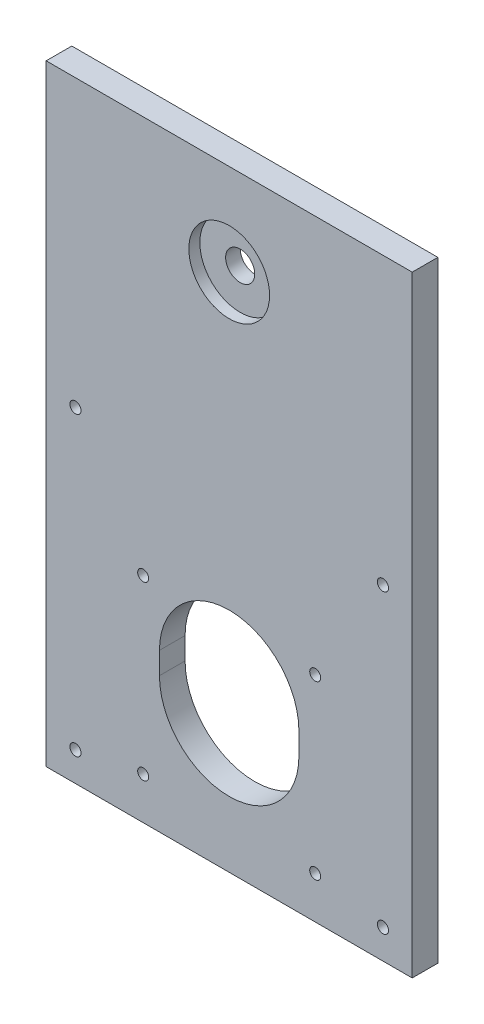
ISO-10303-21;
HEADER;
FILE_DESCRIPTION(('STEP AP214'),'2;1');
FILE_NAME('part.step','',(''),(''),'','','');
FILE_SCHEMA(('AUTOMOTIVE_DESIGN { 1 0 10303 214 1 1 1 1 }'));
ENDSEC;
DATA;
#1=APPLICATION_CONTEXT('core data for automotive mechanical design processes');
#2=APPLICATION_PROTOCOL_DEFINITION('international standard','automotive_design',2000,#1);
#3=PRODUCT_CONTEXT('',#1,'mechanical');
#4=PRODUCT('Part','Part','',(#3));
#5=PRODUCT_RELATED_PRODUCT_CATEGORY('part','',(#4));
#6=PRODUCT_DEFINITION_FORMATION('','',#4);
#7=PRODUCT_DEFINITION_CONTEXT('part definition',#1,'design');
#8=PRODUCT_DEFINITION('design','',#6,#7);
#9=PRODUCT_DEFINITION_SHAPE('','',#8);
#10=(LENGTH_UNIT() NAMED_UNIT(*) SI_UNIT(.MILLI.,.METRE.));
#11=(NAMED_UNIT(*) PLANE_ANGLE_UNIT() SI_UNIT($,.RADIAN.));
#12=(NAMED_UNIT(*) SI_UNIT($,.STERADIAN.) SOLID_ANGLE_UNIT());
#13=UNCERTAINTY_MEASURE_WITH_UNIT(LENGTH_MEASURE(1.E-05),#10,'distance_accuracy_value','');
#14=(GEOMETRIC_REPRESENTATION_CONTEXT(3) GLOBAL_UNCERTAINTY_ASSIGNED_CONTEXT((#13)) GLOBAL_UNIT_ASSIGNED_CONTEXT((#10,
#11,#12)) REPRESENTATION_CONTEXT('',''));
#15=CARTESIAN_POINT('',(0.,0.,0.));
#16=DIRECTION('',(0.,0.,1.));
#17=DIRECTION('',(1.,0.,0.));
#18=AXIS2_PLACEMENT_3D('',#15,#16,#17);
#19=CARTESIAN_POINT('',(0.,18.5,7.));
#20=DIRECTION('',(0.,0.,-1.));
#21=DIRECTION('',(-1.,0.,0.));
#22=AXIS2_PLACEMENT_3D('',#19,#20,#21);
#23=CYLINDRICAL_SURFACE('',#22,3.975);
#24=CARTESIAN_POINT('',(0.,18.5,0.));
#25=DIRECTION('',(0.,0.,1.));
#26=DIRECTION('',(1.,0.,0.));
#27=AXIS2_PLACEMENT_3D('',#24,#25,#26);
#28=CIRCLE('',#27,3.975);
#29=CARTESIAN_POINT('',(3.97499999999999,18.5,0.));
#30=VERTEX_POINT('',#29);
#31=EDGE_CURVE('E218',#30,#30,#28,.T.);
#32=ORIENTED_EDGE('',*,*,#31,.F.);
#33=EDGE_LOOP('',(#32));
#34=FACE_BOUND('',#33,.T.);
#35=CARTESIAN_POINT('',(0.,18.5,4.));
#36=DIRECTION('',(0.,0.,1.));
#37=DIRECTION('',(1.,0.,0.));
#38=AXIS2_PLACEMENT_3D('',#35,#36,#37);
#39=CIRCLE('',#38,3.975);
#40=CARTESIAN_POINT('',(3.97499999999999,18.5,4.));
#41=VERTEX_POINT('',#40);
#42=EDGE_CURVE('E47',#41,#41,#39,.T.);
#43=ORIENTED_EDGE('',*,*,#42,.T.);
#44=EDGE_LOOP('',(#43));
#45=FACE_BOUND('',#44,.T.);
#46=ADVANCED_FACE('F43',(#34,#45),#23,.F.);
#47=CARTESIAN_POINT('',(0.,0.,7.));
#48=DIRECTION('',(0.,0.,1.));
#49=DIRECTION('',(1.,0.,0.));
#50=AXIS2_PLACEMENT_3D('',#47,#48,#49);
#51=PLANE('',#50);
#52=DIRECTION('',(1.,0.,0.));
#53=VECTOR('',#52,1.);
#54=CARTESIAN_POINT('',(-50.,43.5,7.));
#55=LINE('',#54,#53);
#56=CARTESIAN_POINT('',(-50.,43.5,7.));
#57=VERTEX_POINT('',#56);
#58=CARTESIAN_POINT('',(50.,43.5,7.));
#59=VERTEX_POINT('',#58);
#60=EDGE_CURVE('E111',#57,#59,#55,.T.);
#61=ORIENTED_EDGE('',*,*,#60,.F.);
#62=DIRECTION('',(0.,-1.,0.));
#63=VECTOR('',#62,1.);
#64=CARTESIAN_POINT('',(-50.,123.5,7.));
#65=LINE('',#64,#63);
#66=CARTESIAN_POINT('',(-50.,-123.5,7.));
#67=VERTEX_POINT('',#66);
#68=EDGE_CURVE('E151',#57,#67,#65,.T.);
#69=ORIENTED_EDGE('',*,*,#68,.T.);
#70=DIRECTION('',(1.,0.,0.));
#71=VECTOR('',#70,1.);
#72=CARTESIAN_POINT('',(-50.,-123.5,7.));
#73=LINE('',#72,#71);
#74=CARTESIAN_POINT('',(50.,-123.5,7.));
#75=VERTEX_POINT('',#74);
#76=EDGE_CURVE('E143',#67,#75,#73,.T.);
#77=ORIENTED_EDGE('',*,*,#76,.T.);
#78=DIRECTION('',(0.,1.,0.));
#79=VECTOR('',#78,1.);
#80=CARTESIAN_POINT('',(50.,123.5,7.));
#81=LINE('',#80,#79);
#82=EDGE_CURVE('E148',#75,#59,#81,.T.);
#83=ORIENTED_EDGE('',*,*,#82,.T.);
#84=EDGE_LOOP('',(#61,#69,#77,#83));
#85=FACE_BOUND('',#84,.T.);
#86=CARTESIAN_POINT('',(0.,18.5,7.));
#87=DIRECTION('',(0.,0.,1.));
#88=DIRECTION('',(1.,0.,0.));
#89=AXIS2_PLACEMENT_3D('',#86,#87,#88);
#90=CIRCLE('',#89,11.025);
#91=CARTESIAN_POINT('',(11.025,18.5,7.));
#92=VERTEX_POINT('',#91);
#93=EDGE_CURVE('E117',#92,#92,#90,.T.);
#94=ORIENTED_EDGE('',*,*,#93,.F.);
#95=EDGE_LOOP('',(#94));
#96=FACE_BOUND('',#95,.T.);
#97=CARTESIAN_POINT('',(23.5,-112.,7.));
#98=DIRECTION('',(0.,0.,1.));
#99=DIRECTION('',(1.,0.,0.));
#100=AXIS2_PLACEMENT_3D('',#97,#98,#99);
#101=CIRCLE('',#100,1.5);
#102=CARTESIAN_POINT('',(25.,-112.,7.));
#103=VERTEX_POINT('',#102);
#104=EDGE_CURVE('E245',#103,#103,#101,.T.);
#105=ORIENTED_EDGE('',*,*,#104,.F.);
#106=EDGE_LOOP('',(#105));
#107=FACE_BOUND('',#106,.T.);
#108=CARTESIAN_POINT('',(-23.5,-112.,7.));
#109=DIRECTION('',(0.,0.,1.));
#110=DIRECTION('',(1.,0.,0.));
#111=AXIS2_PLACEMENT_3D('',#108,#109,#110);
#112=CIRCLE('',#111,1.5);
#113=CARTESIAN_POINT('',(-22.,-112.,7.));
#114=VERTEX_POINT('',#113);
#115=EDGE_CURVE('E232',#114,#114,#112,.T.);
#116=ORIENTED_EDGE('',*,*,#115,.F.);
#117=EDGE_LOOP('',(#116));
#118=FACE_BOUND('',#117,.T.);
#119=DIRECTION('',(0.,-1.,0.));
#120=VECTOR('',#119,1.);
#121=CARTESIAN_POINT('',(-19.05,-80.5,7.));
#122=LINE('',#121,#120);
#123=CARTESIAN_POINT('',(-19.05,-80.5,7.));
#124=VERTEX_POINT('',#123);
#125=CARTESIAN_POINT('',(-19.05,-86.5,7.));
#126=VERTEX_POINT('',#125);
#127=EDGE_CURVE('E224',#124,#126,#122,.T.);
#128=ORIENTED_EDGE('',*,*,#127,.F.);
#129=CARTESIAN_POINT('',(0.,-80.5,7.));
#130=DIRECTION('',(0.,0.,1.));
#131=DIRECTION('',(1.,0.,0.));
#132=AXIS2_PLACEMENT_3D('',#129,#130,#131);
#133=CIRCLE('',#132,19.05);
#134=CARTESIAN_POINT('',(19.05,-80.5,7.));
#135=VERTEX_POINT('',#134);
#136=EDGE_CURVE('E205',#135,#124,#133,.T.);
#137=ORIENTED_EDGE('',*,*,#136,.F.);
#138=DIRECTION('',(0.,1.,0.));
#139=VECTOR('',#138,1.);
#140=CARTESIAN_POINT('',(19.05,-86.5,7.));
#141=LINE('',#140,#139);
#142=CARTESIAN_POINT('',(19.05,-86.5,7.));
#143=VERTEX_POINT('',#142);
#144=EDGE_CURVE('E200',#143,#135,#141,.T.);
#145=ORIENTED_EDGE('',*,*,#144,.F.);
#146=CARTESIAN_POINT('',(0.,-86.5,7.));
#147=DIRECTION('',(0.,0.,1.));
#148=DIRECTION('',(1.,0.,0.));
#149=AXIS2_PLACEMENT_3D('',#146,#147,#148);
#150=CIRCLE('',#149,19.05);
#151=EDGE_CURVE('E221',#126,#143,#150,.T.);
#152=ORIENTED_EDGE('',*,*,#151,.F.);
#153=EDGE_LOOP('',(#128,#137,#145,#152));
#154=FACE_BOUND('',#153,.T.);
#155=CARTESIAN_POINT('',(42.,-115.5,7.));
#156=DIRECTION('',(0.,0.,1.));
#157=DIRECTION('',(1.,0.,0.));
#158=AXIS2_PLACEMENT_3D('',#155,#156,#157);
#159=CIRCLE('',#158,1.525);
#160=CARTESIAN_POINT('',(43.525,-115.5,7.));
#161=VERTEX_POINT('',#160);
#162=EDGE_CURVE('E176',#161,#161,#159,.T.);
#163=ORIENTED_EDGE('',*,*,#162,.F.);
#164=EDGE_LOOP('',(#163));
#165=FACE_BOUND('',#164,.T.);
#166=CARTESIAN_POINT('',(42.,-34.5,7.));
#167=DIRECTION('',(0.,0.,1.));
#168=DIRECTION('',(1.,0.,0.));
#169=AXIS2_PLACEMENT_3D('',#166,#167,#168);
#170=CIRCLE('',#169,1.525);
#171=CARTESIAN_POINT('',(43.525,-34.5,7.));
#172=VERTEX_POINT('',#171);
#173=EDGE_CURVE('E162',#172,#172,#170,.T.);
#174=ORIENTED_EDGE('',*,*,#173,.F.);
#175=EDGE_LOOP('',(#174));
#176=FACE_BOUND('',#175,.T.);
#177=CARTESIAN_POINT('',(-42.,-34.5,7.));
#178=DIRECTION('',(0.,0.,1.));
#179=DIRECTION('',(1.,0.,0.));
#180=AXIS2_PLACEMENT_3D('',#177,#178,#179);
#181=CIRCLE('',#180,1.525);
#182=CARTESIAN_POINT('',(-40.475,-34.5,7.));
#183=VERTEX_POINT('',#182);
#184=EDGE_CURVE('E133',#183,#183,#181,.T.);
#185=ORIENTED_EDGE('',*,*,#184,.F.);
#186=EDGE_LOOP('',(#185));
#187=FACE_BOUND('',#186,.T.);
#188=CARTESIAN_POINT('',(-42.,-115.5,7.));
#189=DIRECTION('',(0.,0.,1.));
#190=DIRECTION('',(1.,0.,0.));
#191=AXIS2_PLACEMENT_3D('',#188,#189,#190);
#192=CIRCLE('',#191,1.525);
#193=CARTESIAN_POINT('',(-40.475,-115.5,7.));
#194=VERTEX_POINT('',#193);
#195=EDGE_CURVE('E168',#194,#194,#192,.T.);
#196=ORIENTED_EDGE('',*,*,#195,.F.);
#197=EDGE_LOOP('',(#196));
#198=FACE_BOUND('',#197,.T.);
#199=CARTESIAN_POINT('',(-23.5,-65.,7.));
#200=DIRECTION('',(0.,0.,1.));
#201=DIRECTION('',(1.,0.,0.));
#202=AXIS2_PLACEMENT_3D('',#199,#200,#201);
#203=CIRCLE('',#202,1.5);
#204=CARTESIAN_POINT('',(-22.,-65.,7.));
#205=VERTEX_POINT('',#204);
#206=EDGE_CURVE('E237',#205,#205,#203,.T.);
#207=ORIENTED_EDGE('',*,*,#206,.F.);
#208=EDGE_LOOP('',(#207));
#209=FACE_BOUND('',#208,.T.);
#210=CARTESIAN_POINT('',(23.5,-65.,7.));
#211=DIRECTION('',(0.,0.,1.));
#212=DIRECTION('',(1.,0.,0.));
#213=AXIS2_PLACEMENT_3D('',#210,#211,#212);
#214=CIRCLE('',#213,1.5);
#215=CARTESIAN_POINT('',(25.,-65.,7.));
#216=VERTEX_POINT('',#215);
#217=EDGE_CURVE('E253',#216,#216,#214,.T.);
#218=ORIENTED_EDGE('',*,*,#217,.F.);
#219=EDGE_LOOP('',(#218));
#220=FACE_BOUND('',#219,.T.);
#221=ADVANCED_FACE('F292',(#85,#96,#107,#118,#154,#165,#176,#187,#198,#209,#220),#51,.T.);
#222=CARTESIAN_POINT('',(0.,0.,0.));
#223=DIRECTION('',(0.,0.,1.));
#224=DIRECTION('',(1.,0.,0.));
#225=AXIS2_PLACEMENT_3D('',#222,#223,#224);
#226=PLANE('',#225);
#227=CARTESIAN_POINT('',(42.,-115.5,0.));
#228=DIRECTION('',(0.,0.,1.));
#229=DIRECTION('',(1.,0.,0.));
#230=AXIS2_PLACEMENT_3D('',#227,#228,#229);
#231=CIRCLE('',#230,1.525);
#232=CARTESIAN_POINT('',(43.525,-115.5,0.));
#233=VERTEX_POINT('',#232);
#234=EDGE_CURVE('E180',#233,#233,#231,.T.);
#235=ORIENTED_EDGE('',*,*,#234,.T.);
#236=EDGE_LOOP('',(#235));
#237=FACE_BOUND('',#236,.T.);
#238=CARTESIAN_POINT('',(-42.,-115.5,0.));
#239=DIRECTION('',(0.,0.,1.));
#240=DIRECTION('',(1.,0.,0.));
#241=AXIS2_PLACEMENT_3D('',#238,#239,#240);
#242=CIRCLE('',#241,1.525);
#243=CARTESIAN_POINT('',(-40.475,-115.5,0.));
#244=VERTEX_POINT('',#243);
#245=EDGE_CURVE('E172',#244,#244,#242,.T.);
#246=ORIENTED_EDGE('',*,*,#245,.T.);
#247=EDGE_LOOP('',(#246));
#248=FACE_BOUND('',#247,.T.);
#249=CARTESIAN_POINT('',(42.,-34.5,0.));
#250=DIRECTION('',(0.,0.,1.));
#251=DIRECTION('',(1.,0.,0.));
#252=AXIS2_PLACEMENT_3D('',#249,#250,#251);
#253=CIRCLE('',#252,1.525);
#254=CARTESIAN_POINT('',(43.525,-34.5,0.));
#255=VERTEX_POINT('',#254);
#256=EDGE_CURVE('E164',#255,#255,#253,.T.);
#257=ORIENTED_EDGE('',*,*,#256,.T.);
#258=EDGE_LOOP('',(#257));
#259=FACE_BOUND('',#258,.T.);
#260=CARTESIAN_POINT('',(-42.,-34.5,0.));
#261=DIRECTION('',(0.,0.,1.));
#262=DIRECTION('',(1.,0.,0.));
#263=AXIS2_PLACEMENT_3D('',#260,#261,#262);
#264=CIRCLE('',#263,1.525);
#265=CARTESIAN_POINT('',(-40.475,-34.5,0.));
#266=VERTEX_POINT('',#265);
#267=EDGE_CURVE('E140',#266,#266,#264,.T.);
#268=ORIENTED_EDGE('',*,*,#267,.T.);
#269=EDGE_LOOP('',(#268));
#270=FACE_BOUND('',#269,.T.);
#271=DIRECTION('',(0.,-1.,0.));
#272=VECTOR('',#271,1.);
#273=CARTESIAN_POINT('',(-50.,123.5,0.));
#274=LINE('',#273,#272);
#275=CARTESIAN_POINT('',(-50.,43.5,0.));
#276=VERTEX_POINT('',#275);
#277=CARTESIAN_POINT('',(-50.,-123.5,0.));
#278=VERTEX_POINT('',#277);
#279=EDGE_CURVE('E127',#276,#278,#274,.T.);
#280=ORIENTED_EDGE('',*,*,#279,.F.);
#281=DIRECTION('',(1.,0.,0.));
#282=VECTOR('',#281,1.);
#283=CARTESIAN_POINT('',(-50.,43.5,0.));
#284=LINE('',#283,#282);
#285=CARTESIAN_POINT('',(50.,43.5,0.));
#286=VERTEX_POINT('',#285);
#287=EDGE_CURVE('E60',#276,#286,#284,.T.);
#288=ORIENTED_EDGE('',*,*,#287,.T.);
#289=DIRECTION('',(0.,1.,0.));
#290=VECTOR('',#289,1.);
#291=CARTESIAN_POINT('',(50.,123.5,0.));
#292=LINE('',#291,#290);
#293=CARTESIAN_POINT('',(50.,-123.5,0.));
#294=VERTEX_POINT('',#293);
#295=EDGE_CURVE('E126',#294,#286,#292,.T.);
#296=ORIENTED_EDGE('',*,*,#295,.F.);
#297=DIRECTION('',(1.,0.,0.));
#298=VECTOR('',#297,1.);
#299=CARTESIAN_POINT('',(-50.,-123.5,0.));
#300=LINE('',#299,#298);
#301=EDGE_CURVE('E137',#278,#294,#300,.T.);
#302=ORIENTED_EDGE('',*,*,#301,.F.);
#303=EDGE_LOOP('',(#280,#288,#296,#302));
#304=FACE_BOUND('',#303,.T.);
#305=CARTESIAN_POINT('',(0.,-80.5,0.));
#306=DIRECTION('',(0.,0.,1.));
#307=DIRECTION('',(1.,0.,0.));
#308=AXIS2_PLACEMENT_3D('',#305,#306,#307);
#309=CIRCLE('',#308,19.05);
#310=CARTESIAN_POINT('',(19.05,-80.5,0.));
#311=VERTEX_POINT('',#310);
#312=CARTESIAN_POINT('',(-19.05,-80.5,0.));
#313=VERTEX_POINT('',#312);
#314=EDGE_CURVE('E214',#311,#313,#309,.T.);
#315=ORIENTED_EDGE('',*,*,#314,.T.);
#316=DIRECTION('',(0.,-1.,0.));
#317=VECTOR('',#316,1.);
#318=CARTESIAN_POINT('',(-19.05,-80.5,0.));
#319=LINE('',#318,#317);
#320=CARTESIAN_POINT('',(-19.05,-86.5,0.));
#321=VERTEX_POINT('',#320);
#322=EDGE_CURVE('E210',#313,#321,#319,.T.);
#323=ORIENTED_EDGE('',*,*,#322,.T.);
#324=CARTESIAN_POINT('',(0.,-86.5,0.));
#325=DIRECTION('',(0.,0.,1.));
#326=DIRECTION('',(1.,0.,0.));
#327=AXIS2_PLACEMENT_3D('',#324,#325,#326);
#328=CIRCLE('',#327,19.05);
#329=CARTESIAN_POINT('',(19.05,-86.5,0.));
#330=VERTEX_POINT('',#329);
#331=EDGE_CURVE('E206',#321,#330,#328,.T.);
#332=ORIENTED_EDGE('',*,*,#331,.T.);
#333=DIRECTION('',(0.,1.,0.));
#334=VECTOR('',#333,1.);
#335=CARTESIAN_POINT('',(19.05,-86.5,0.));
#336=LINE('',#335,#334);
#337=EDGE_CURVE('E201',#330,#311,#336,.T.);
#338=ORIENTED_EDGE('',*,*,#337,.T.);
#339=EDGE_LOOP('',(#315,#323,#332,#338));
#340=FACE_BOUND('',#339,.T.);
#341=ORIENTED_EDGE('',*,*,#31,.T.);
#342=EDGE_LOOP('',(#341));
#343=FACE_BOUND('',#342,.T.);
#344=CARTESIAN_POINT('',(-23.5,-112.,0.));
#345=DIRECTION('',(0.,0.,1.));
#346=DIRECTION('',(1.,0.,0.));
#347=AXIS2_PLACEMENT_3D('',#344,#345,#346);
#348=CIRCLE('',#347,1.5);
#349=CARTESIAN_POINT('',(-22.,-112.,0.));
#350=VERTEX_POINT('',#349);
#351=EDGE_CURVE('E233',#350,#350,#348,.T.);
#352=ORIENTED_EDGE('',*,*,#351,.T.);
#353=EDGE_LOOP('',(#352));
#354=FACE_BOUND('',#353,.T.);
#355=CARTESIAN_POINT('',(-23.5,-65.,0.));
#356=DIRECTION('',(0.,0.,1.));
#357=DIRECTION('',(1.,0.,0.));
#358=AXIS2_PLACEMENT_3D('',#355,#356,#357);
#359=CIRCLE('',#358,1.5);
#360=CARTESIAN_POINT('',(-22.,-65.,0.));
#361=VERTEX_POINT('',#360);
#362=EDGE_CURVE('E241',#361,#361,#359,.T.);
#363=ORIENTED_EDGE('',*,*,#362,.T.);
#364=EDGE_LOOP('',(#363));
#365=FACE_BOUND('',#364,.T.);
#366=CARTESIAN_POINT('',(23.5,-112.,0.));
#367=DIRECTION('',(0.,0.,1.));
#368=DIRECTION('',(1.,0.,0.));
#369=AXIS2_PLACEMENT_3D('',#366,#367,#368);
#370=CIRCLE('',#369,1.5);
#371=CARTESIAN_POINT('',(25.,-112.,0.));
#372=VERTEX_POINT('',#371);
#373=EDGE_CURVE('E249',#372,#372,#370,.T.);
#374=ORIENTED_EDGE('',*,*,#373,.T.);
#375=EDGE_LOOP('',(#374));
#376=FACE_BOUND('',#375,.T.);
#377=CARTESIAN_POINT('',(23.5,-65.,0.));
#378=DIRECTION('',(0.,0.,1.));
#379=DIRECTION('',(1.,0.,0.));
#380=AXIS2_PLACEMENT_3D('',#377,#378,#379);
#381=CIRCLE('',#380,1.5);
#382=CARTESIAN_POINT('',(25.,-65.,0.));
#383=VERTEX_POINT('',#382);
#384=EDGE_CURVE('E257',#383,#383,#381,.T.);
#385=ORIENTED_EDGE('',*,*,#384,.T.);
#386=EDGE_LOOP('',(#385));
#387=FACE_BOUND('',#386,.T.);
#388=ADVANCED_FACE('F123',(#237,#248,#259,#270,#304,#340,#343,#354,#365,#376,#387),#226,.F.);
#389=CARTESIAN_POINT('',(50.,123.5,7.));
#390=DIRECTION('',(-1.,0.,0.));
#391=DIRECTION('',(0.,-1.,0.));
#392=AXIS2_PLACEMENT_3D('',#389,#390,#391);
#393=PLANE('',#392);
#394=ORIENTED_EDGE('',*,*,#295,.T.);
#395=DIRECTION('',(0.,0.,1.));
#396=VECTOR('',#395,1.);
#397=CARTESIAN_POINT('',(50.,43.5,0.));
#398=LINE('',#397,#396);
#399=EDGE_CURVE('E108',#286,#59,#398,.T.);
#400=ORIENTED_EDGE('',*,*,#399,.T.);
#401=ORIENTED_EDGE('',*,*,#82,.F.);
#402=DIRECTION('',(0.,0.,-1.));
#403=VECTOR('',#402,1.);
#404=CARTESIAN_POINT('',(50.,-123.5,7.));
#405=LINE('',#404,#403);
#406=EDGE_CURVE('E53',#75,#294,#405,.T.);
#407=ORIENTED_EDGE('',*,*,#406,.T.);
#408=EDGE_LOOP('',(#394,#400,#401,#407));
#409=FACE_BOUND('',#408,.T.);
#410=ADVANCED_FACE('F45',(#409),#393,.F.);
#411=CARTESIAN_POINT('',(-50.,123.5,7.));
#412=DIRECTION('',(1.,0.,0.));
#413=DIRECTION('',(0.,1.,0.));
#414=AXIS2_PLACEMENT_3D('',#411,#412,#413);
#415=PLANE('',#414);
#416=ORIENTED_EDGE('',*,*,#68,.F.);
#417=DIRECTION('',(0.,0.,1.));
#418=VECTOR('',#417,1.);
#419=CARTESIAN_POINT('',(-50.,43.5,0.));
#420=LINE('',#419,#418);
#421=EDGE_CURVE('E118',#276,#57,#420,.T.);
#422=ORIENTED_EDGE('',*,*,#421,.F.);
#423=ORIENTED_EDGE('',*,*,#279,.T.);
#424=DIRECTION('',(0.,0.,-1.));
#425=VECTOR('',#424,1.);
#426=CARTESIAN_POINT('',(-50.,-123.5,7.));
#427=LINE('',#426,#425);
#428=EDGE_CURVE('E11',#67,#278,#427,.T.);
#429=ORIENTED_EDGE('',*,*,#428,.F.);
#430=EDGE_LOOP('',(#416,#422,#423,#429));
#431=FACE_BOUND('',#430,.T.);
#432=ADVANCED_FACE('F328',(#431),#415,.F.);
#433=CARTESIAN_POINT('',(-50.,-123.5,7.));
#434=DIRECTION('',(0.,1.,0.));
#435=DIRECTION('',(0.,0.,1.));
#436=AXIS2_PLACEMENT_3D('',#433,#434,#435);
#437=PLANE('',#436);
#438=ORIENTED_EDGE('',*,*,#301,.T.);
#439=ORIENTED_EDGE('',*,*,#406,.F.);
#440=ORIENTED_EDGE('',*,*,#76,.F.);
#441=ORIENTED_EDGE('',*,*,#428,.T.);
#442=EDGE_LOOP('',(#438,#439,#440,#441));
#443=FACE_BOUND('',#442,.T.);
#444=ADVANCED_FACE('F370',(#443),#437,.F.);
#445=CARTESIAN_POINT('',(-42.,-34.5,7.));
#446=DIRECTION('',(0.,0.,-1.));
#447=DIRECTION('',(-1.,0.,0.));
#448=AXIS2_PLACEMENT_3D('',#445,#446,#447);
#449=CYLINDRICAL_SURFACE('',#448,1.525);
#450=ORIENTED_EDGE('',*,*,#184,.T.);
#451=EDGE_LOOP('',(#450));
#452=FACE_BOUND('',#451,.T.);
#453=ORIENTED_EDGE('',*,*,#267,.F.);
#454=EDGE_LOOP('',(#453));
#455=FACE_BOUND('',#454,.T.);
#456=ADVANCED_FACE('F367',(#452,#455),#449,.F.);
#457=CARTESIAN_POINT('',(42.,-34.5,7.));
#458=DIRECTION('',(0.,0.,-1.));
#459=DIRECTION('',(-1.,0.,0.));
#460=AXIS2_PLACEMENT_3D('',#457,#458,#459);
#461=CYLINDRICAL_SURFACE('',#460,1.525);
#462=ORIENTED_EDGE('',*,*,#173,.T.);
#463=EDGE_LOOP('',(#462));
#464=FACE_BOUND('',#463,.T.);
#465=ORIENTED_EDGE('',*,*,#256,.F.);
#466=EDGE_LOOP('',(#465));
#467=FACE_BOUND('',#466,.T.);
#468=ADVANCED_FACE('F363',(#464,#467),#461,.F.);
#469=CARTESIAN_POINT('',(-42.,-115.5,7.));
#470=DIRECTION('',(0.,0.,-1.));
#471=DIRECTION('',(-1.,0.,0.));
#472=AXIS2_PLACEMENT_3D('',#469,#470,#471);
#473=CYLINDRICAL_SURFACE('',#472,1.525);
#474=ORIENTED_EDGE('',*,*,#195,.T.);
#475=EDGE_LOOP('',(#474));
#476=FACE_BOUND('',#475,.T.);
#477=ORIENTED_EDGE('',*,*,#245,.F.);
#478=EDGE_LOOP('',(#477));
#479=FACE_BOUND('',#478,.T.);
#480=ADVANCED_FACE('F359',(#476,#479),#473,.F.);
#481=CARTESIAN_POINT('',(42.,-115.5,7.));
#482=DIRECTION('',(0.,0.,-1.));
#483=DIRECTION('',(-1.,0.,0.));
#484=AXIS2_PLACEMENT_3D('',#481,#482,#483);
#485=CYLINDRICAL_SURFACE('',#484,1.525);
#486=ORIENTED_EDGE('',*,*,#162,.T.);
#487=EDGE_LOOP('',(#486));
#488=FACE_BOUND('',#487,.T.);
#489=ORIENTED_EDGE('',*,*,#234,.F.);
#490=EDGE_LOOP('',(#489));
#491=FACE_BOUND('',#490,.T.);
#492=ADVANCED_FACE('F355',(#488,#491),#485,.F.);
#493=CARTESIAN_POINT('',(0.,-80.5,7.));
#494=DIRECTION('',(0.,0.,-1.));
#495=DIRECTION('',(-1.,0.,0.));
#496=AXIS2_PLACEMENT_3D('',#493,#494,#495);
#497=CYLINDRICAL_SURFACE('',#496,19.05);
#498=ORIENTED_EDGE('',*,*,#314,.F.);
#499=DIRECTION('',(0.,0.,-1.));
#500=VECTOR('',#499,1.);
#501=CARTESIAN_POINT('',(19.05,-80.5,7.));
#502=LINE('',#501,#500);
#503=EDGE_CURVE('E196',#135,#311,#502,.T.);
#504=ORIENTED_EDGE('',*,*,#503,.F.);
#505=ORIENTED_EDGE('',*,*,#136,.T.);
#506=DIRECTION('',(0.,0.,-1.));
#507=VECTOR('',#506,1.);
#508=CARTESIAN_POINT('',(-19.05,-80.5,7.));
#509=LINE('',#508,#507);
#510=EDGE_CURVE('E184',#124,#313,#509,.T.);
#511=ORIENTED_EDGE('',*,*,#510,.T.);
#512=EDGE_LOOP('',(#498,#504,#505,#511));
#513=FACE_BOUND('',#512,.T.);
#514=ADVANCED_FACE('F351',(#513),#497,.F.);
#515=CARTESIAN_POINT('',(-19.05,-80.5,7.));
#516=DIRECTION('',(1.,0.,0.));
#517=DIRECTION('',(0.,1.,0.));
#518=AXIS2_PLACEMENT_3D('',#515,#516,#517);
#519=PLANE('',#518);
#520=ORIENTED_EDGE('',*,*,#322,.F.);
#521=ORIENTED_EDGE('',*,*,#510,.F.);
#522=ORIENTED_EDGE('',*,*,#127,.T.);
#523=DIRECTION('',(0.,0.,-1.));
#524=VECTOR('',#523,1.);
#525=CARTESIAN_POINT('',(-19.05,-86.5,7.));
#526=LINE('',#525,#524);
#527=EDGE_CURVE('E191',#126,#321,#526,.T.);
#528=ORIENTED_EDGE('',*,*,#527,.T.);
#529=EDGE_LOOP('',(#520,#521,#522,#528));
#530=FACE_BOUND('',#529,.T.);
#531=ADVANCED_FACE('F347',(#530),#519,.T.);
#532=CARTESIAN_POINT('',(0.,-86.5,7.));
#533=DIRECTION('',(0.,0.,-1.));
#534=DIRECTION('',(-1.,0.,0.));
#535=AXIS2_PLACEMENT_3D('',#532,#533,#534);
#536=CYLINDRICAL_SURFACE('',#535,19.05);
#537=ORIENTED_EDGE('',*,*,#331,.F.);
#538=ORIENTED_EDGE('',*,*,#527,.F.);
#539=ORIENTED_EDGE('',*,*,#151,.T.);
#540=DIRECTION('',(0.,0.,-1.));
#541=VECTOR('',#540,1.);
#542=CARTESIAN_POINT('',(19.05,-86.5,7.));
#543=LINE('',#542,#541);
#544=EDGE_CURVE('E68',#143,#330,#543,.T.);
#545=ORIENTED_EDGE('',*,*,#544,.T.);
#546=EDGE_LOOP('',(#537,#538,#539,#545));
#547=FACE_BOUND('',#546,.T.);
#548=ADVANCED_FACE('F344',(#547),#536,.F.);
#549=CARTESIAN_POINT('',(19.05,-86.5,7.));
#550=DIRECTION('',(-1.,0.,0.));
#551=DIRECTION('',(0.,-1.,0.));
#552=AXIS2_PLACEMENT_3D('',#549,#550,#551);
#553=PLANE('',#552);
#554=ORIENTED_EDGE('',*,*,#337,.F.);
#555=ORIENTED_EDGE('',*,*,#544,.F.);
#556=ORIENTED_EDGE('',*,*,#144,.T.);
#557=ORIENTED_EDGE('',*,*,#503,.T.);
#558=EDGE_LOOP('',(#554,#555,#556,#557));
#559=FACE_BOUND('',#558,.T.);
#560=ADVANCED_FACE('F341',(#559),#553,.T.);
#561=CARTESIAN_POINT('',(-23.5,-112.,7.));
#562=DIRECTION('',(0.,0.,-1.));
#563=DIRECTION('',(-1.,0.,0.));
#564=AXIS2_PLACEMENT_3D('',#561,#562,#563);
#565=CYLINDRICAL_SURFACE('',#564,1.5);
#566=ORIENTED_EDGE('',*,*,#115,.T.);
#567=EDGE_LOOP('',(#566));
#568=FACE_BOUND('',#567,.T.);
#569=ORIENTED_EDGE('',*,*,#351,.F.);
#570=EDGE_LOOP('',(#569));
#571=FACE_BOUND('',#570,.T.);
#572=ADVANCED_FACE('F339',(#568,#571),#565,.F.);
#573=CARTESIAN_POINT('',(-23.5,-65.,7.));
#574=DIRECTION('',(0.,0.,-1.));
#575=DIRECTION('',(-1.,0.,0.));
#576=AXIS2_PLACEMENT_3D('',#573,#574,#575);
#577=CYLINDRICAL_SURFACE('',#576,1.5);
#578=ORIENTED_EDGE('',*,*,#206,.T.);
#579=EDGE_LOOP('',(#578));
#580=FACE_BOUND('',#579,.T.);
#581=ORIENTED_EDGE('',*,*,#362,.F.);
#582=EDGE_LOOP('',(#581));
#583=FACE_BOUND('',#582,.T.);
#584=ADVANCED_FACE('F439',(#580,#583),#577,.F.);
#585=CARTESIAN_POINT('',(23.5,-112.,7.));
#586=DIRECTION('',(0.,0.,-1.));
#587=DIRECTION('',(-1.,0.,0.));
#588=AXIS2_PLACEMENT_3D('',#585,#586,#587);
#589=CYLINDRICAL_SURFACE('',#588,1.5);
#590=ORIENTED_EDGE('',*,*,#104,.T.);
#591=EDGE_LOOP('',(#590));
#592=FACE_BOUND('',#591,.T.);
#593=ORIENTED_EDGE('',*,*,#373,.F.);
#594=EDGE_LOOP('',(#593));
#595=FACE_BOUND('',#594,.T.);
#596=ADVANCED_FACE('F318',(#592,#595),#589,.F.);
#597=CARTESIAN_POINT('',(23.5,-65.,7.));
#598=DIRECTION('',(0.,0.,-1.));
#599=DIRECTION('',(-1.,0.,0.));
#600=AXIS2_PLACEMENT_3D('',#597,#598,#599);
#601=CYLINDRICAL_SURFACE('',#600,1.5);
#602=ORIENTED_EDGE('',*,*,#217,.T.);
#603=EDGE_LOOP('',(#602));
#604=FACE_BOUND('',#603,.T.);
#605=ORIENTED_EDGE('',*,*,#384,.F.);
#606=EDGE_LOOP('',(#605));
#607=FACE_BOUND('',#606,.T.);
#608=ADVANCED_FACE('F288',(#604,#607),#601,.F.);
#609=CARTESIAN_POINT('',(0.,18.5,4.));
#610=DIRECTION('',(0.,0.,1.));
#611=DIRECTION('',(1.,0.,0.));
#612=AXIS2_PLACEMENT_3D('',#609,#610,#611);
#613=CYLINDRICAL_SURFACE('',#612,11.025);
#614=CARTESIAN_POINT('',(0.,18.5,4.));
#615=DIRECTION('',(0.,0.,1.));
#616=DIRECTION('',(1.,0.,0.));
#617=AXIS2_PLACEMENT_3D('',#614,#615,#616);
#618=CIRCLE('',#617,11.025);
#619=CARTESIAN_POINT('',(11.025,18.5,4.));
#620=VERTEX_POINT('',#619);
#621=EDGE_CURVE('E267',#620,#620,#618,.T.);
#622=ORIENTED_EDGE('',*,*,#621,.F.);
#623=EDGE_LOOP('',(#622));
#624=FACE_BOUND('',#623,.T.);
#625=ORIENTED_EDGE('',*,*,#93,.T.);
#626=EDGE_LOOP('',(#625));
#627=FACE_BOUND('',#626,.T.);
#628=ADVANCED_FACE('F282',(#624,#627),#613,.F.);
#629=CARTESIAN_POINT('',(0.,18.5,4.));
#630=DIRECTION('',(0.,0.,1.));
#631=DIRECTION('',(1.,0.,0.));
#632=AXIS2_PLACEMENT_3D('',#629,#630,#631);
#633=PLANE('',#632);
#634=ORIENTED_EDGE('',*,*,#42,.F.);
#635=EDGE_LOOP('',(#634));
#636=FACE_BOUND('',#635,.T.);
#637=ORIENTED_EDGE('',*,*,#621,.T.);
#638=EDGE_LOOP('',(#637));
#639=FACE_BOUND('',#638,.T.);
#640=ADVANCED_FACE('F279',(#636,#639),#633,.T.);
#641=CARTESIAN_POINT('',(-50.,43.5,0.));
#642=DIRECTION('',(0.,-1.,0.));
#643=DIRECTION('',(0.,0.,-1.));
#644=AXIS2_PLACEMENT_3D('',#641,#642,#643);
#645=PLANE('',#644);
#646=ORIENTED_EDGE('',*,*,#60,.T.);
#647=ORIENTED_EDGE('',*,*,#399,.F.);
#648=ORIENTED_EDGE('',*,*,#287,.F.);
#649=ORIENTED_EDGE('',*,*,#421,.T.);
#650=EDGE_LOOP('',(#646,#647,#648,#649));
#651=FACE_BOUND('',#650,.T.);
#652=ADVANCED_FACE('F109',(#651),#645,.F.);
#653=CLOSED_SHELL('',(#46,#221,#388,#410,#432,#444,#456,#468,#480,#492,#514,#531,#548,#560,#572,
#584,#596,#608,#628,#640,#652));
#654=MANIFOLD_SOLID_BREP('B2',#653);
#655=ADVANCED_BREP_SHAPE_REPRESENTATION('',(#18,#654),#14);
#656=SHAPE_DEFINITION_REPRESENTATION(#9,#655);
ENDSEC;
END-ISO-10303-21;
